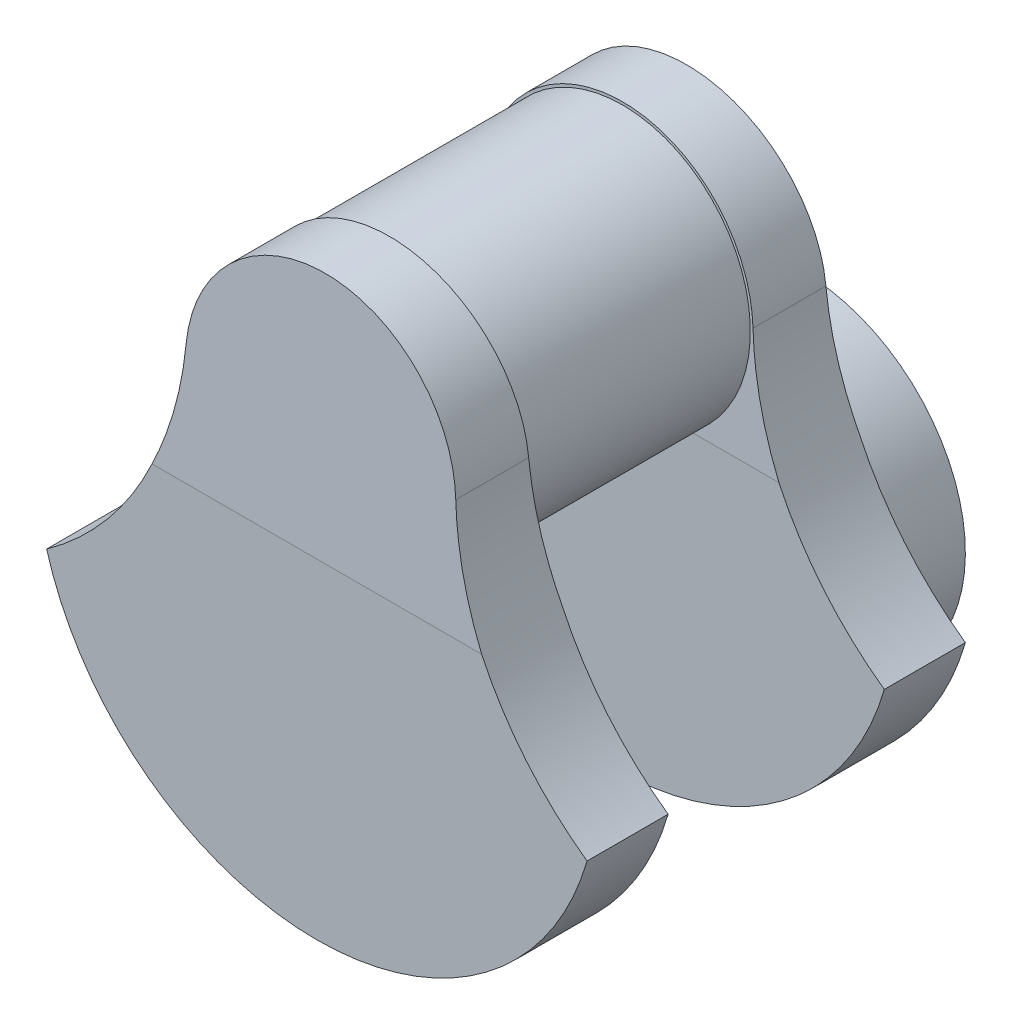
ISO-10303-21;
HEADER;
FILE_DESCRIPTION(('STEP AP214'),'2;1');
FILE_NAME('part.step','',(''),(''),'','','');
FILE_SCHEMA(('AUTOMOTIVE_DESIGN { 1 0 10303 214 1 1 1 1 }'));
ENDSEC;
DATA;
#1=APPLICATION_CONTEXT('core data for automotive mechanical design processes');
#2=APPLICATION_PROTOCOL_DEFINITION('international standard','automotive_design',2000,#1);
#3=PRODUCT_CONTEXT('',#1,'mechanical');
#4=PRODUCT('Part','Part','',(#3));
#5=PRODUCT_RELATED_PRODUCT_CATEGORY('part','',(#4));
#6=PRODUCT_DEFINITION_FORMATION('','',#4);
#7=PRODUCT_DEFINITION_CONTEXT('part definition',#1,'design');
#8=PRODUCT_DEFINITION('design','',#6,#7);
#9=PRODUCT_DEFINITION_SHAPE('','',#8);
#10=(LENGTH_UNIT() NAMED_UNIT(*) SI_UNIT(.MILLI.,.METRE.));
#11=(NAMED_UNIT(*) PLANE_ANGLE_UNIT() SI_UNIT($,.RADIAN.));
#12=(NAMED_UNIT(*) SI_UNIT($,.STERADIAN.) SOLID_ANGLE_UNIT());
#13=UNCERTAINTY_MEASURE_WITH_UNIT(LENGTH_MEASURE(1.E-05),#10,'distance_accuracy_value','');
#14=(GEOMETRIC_REPRESENTATION_CONTEXT(3) GLOBAL_UNCERTAINTY_ASSIGNED_CONTEXT((#13)) GLOBAL_UNIT_ASSIGNED_CONTEXT((#10,
#11,#12)) REPRESENTATION_CONTEXT('',''));
#15=CARTESIAN_POINT('',(0.,0.,0.));
#16=DIRECTION('',(0.,0.,1.));
#17=DIRECTION('',(1.,0.,0.));
#18=AXIS2_PLACEMENT_3D('',#15,#16,#17);
#19=CARTESIAN_POINT('',(-49.9962379807444,29.,-47.5));
#20=DIRECTION('',(0.,-0.0348994967024933,-0.999390827019096));
#21=DIRECTION('',(0.,0.999390827019096,-0.0348994967024933));
#22=AXIS2_PLACEMENT_3D('',#19,#20,#21);
#23=PLANE('',#22);
#24=CARTESIAN_POINT('',(0.,49.,-48.1984153898348));
#25=DIRECTION('',(0.,-0.0348994967024933,-0.999390827019096));
#26=DIRECTION('',(0.,-0.999390827019096,0.0348994967024933));
#27=AXIS2_PLACEMENT_3D('',#24,#25,#26);
#28=ELLIPSE('',#27,24.5149338353211,24.5);
#29=CARTESIAN_POINT('',(14.1509716980846,28.9999999999998,-47.5));
#30=VERTEX_POINT('',#29);
#31=CARTESIAN_POINT('',(-14.1509716980849,29.,-47.5));
#32=VERTEX_POINT('',#31);
#33=EDGE_CURVE('E45',#30,#32,#28,.F.);
#34=ORIENTED_EDGE('',*,*,#33,.F.);
#35=DIRECTION('',(1.,0.,0.));
#36=VECTOR('',#35,1.);
#37=CARTESIAN_POINT('',(42.412093190922,28.9999999999998,-47.5));
#38=LINE('',#37,#36);
#39=CARTESIAN_POINT('',(30.4957879413426,29.,-47.5));
#40=VERTEX_POINT('',#39);
#41=EDGE_CURVE('E156',#30,#40,#38,.T.);
#42=ORIENTED_EDGE('',*,*,#41,.T.);
#43=CARTESIAN_POINT('',(84.8241863818441,54.464192955798,-48.3892292125026));
#44=DIRECTION('',(0.,-0.0348994967024933,-0.999390827019096));
#45=DIRECTION('',(0.,0.999390827019096,-0.0348994967024933));
#46=AXIS2_PLACEMENT_3D('',#43,#44,#45);
#47=ELLIPSE('',#46,60.0365726579294,60.0000000000001);
#48=CARTESIAN_POINT('',(24.9482901123071,50.6071155752347,-48.2545371023842));
#49=VERTEX_POINT('',#48);
#50=EDGE_CURVE('E194',#49,#40,#47,.F.);
#51=ORIENTED_EDGE('',*,*,#50,.F.);
#52=CARTESIAN_POINT('',(0.,49.,-48.1984153898348));
#53=DIRECTION('',(0.,-0.0348994967024933,-0.999390827019096));
#54=DIRECTION('',(0.,0.999390827019096,-0.0348994967024933));
#55=AXIS2_PLACEMENT_3D('',#52,#53,#54);
#56=ELLIPSE('',#55,25.0152386074705,25.);
#57=CARTESIAN_POINT('',(-24.9482901123071,50.6071155752347,-48.2545371023842));
#58=VERTEX_POINT('',#57);
#59=EDGE_CURVE('E190',#58,#49,#56,.T.);
#60=ORIENTED_EDGE('',*,*,#59,.F.);
#61=CARTESIAN_POINT('',(-84.8241863818444,54.4641929557982,-48.3892292125026));
#62=DIRECTION('',(0.,-0.0348994967024933,-0.999390827019096));
#63=DIRECTION('',(0.,0.999390827019096,-0.0348994967024933));
#64=AXIS2_PLACEMENT_3D('',#61,#62,#63);
#65=ELLIPSE('',#64,60.0365726579297,60.0000000000004);
#66=CARTESIAN_POINT('',(-30.4957879413426,29.,-47.5));
#67=VERTEX_POINT('',#66);
#68=EDGE_CURVE('E186',#67,#58,#65,.F.);
#69=ORIENTED_EDGE('',*,*,#68,.F.);
#70=EDGE_CURVE('E315',#67,#32,#38,.T.);
#71=ORIENTED_EDGE('',*,*,#70,.T.);
#72=EDGE_LOOP('',(#34,#42,#51,#60,#69,#71));
#73=FACE_BOUND('',#72,.T.);
#74=ADVANCED_FACE('F41',(#73),#23,.F.);
#75=CARTESIAN_POINT('',(0.,20.,7.5));
#76=DIRECTION('',(0.,0.,-1.));
#77=DIRECTION('',(-1.,0.,0.));
#78=AXIS2_PLACEMENT_3D('',#75,#76,#77);
#79=CYLINDRICAL_SURFACE('',#78,52.02671366031);
#80=CARTESIAN_POINT('',(0.,20.,-7.5));
#81=DIRECTION('',(0.,0.,1.));
#82=DIRECTION('',(1.,0.,0.));
#83=AXIS2_PLACEMENT_3D('',#80,#81,#82);
#84=CIRCLE('',#83,52.02671366031);
#85=CARTESIAN_POINT('',(-49.9962379807444,5.60711557523474,-7.5));
#86=VERTEX_POINT('',#85);
#87=CARTESIAN_POINT('',(49.9962379807444,5.60711557523472,-7.5));
#88=VERTEX_POINT('',#87);
#89=EDGE_CURVE('E262',#86,#88,#84,.T.);
#90=ORIENTED_EDGE('',*,*,#89,.T.);
#91=DIRECTION('',(0.,0.,-1.));
#92=VECTOR('',#91,1.);
#93=CARTESIAN_POINT('',(49.9962379807444,5.60711557523472,7.5));
#94=LINE('',#93,#92);
#95=CARTESIAN_POINT('',(49.9962379807444,5.60711557523472,7.5));
#96=VERTEX_POINT('',#95);
#97=EDGE_CURVE('E296',#96,#88,#94,.T.);
#98=ORIENTED_EDGE('',*,*,#97,.F.);
#99=CARTESIAN_POINT('',(0.,20.,7.5));
#100=DIRECTION('',(0.,0.,1.));
#101=DIRECTION('',(1.,0.,0.));
#102=AXIS2_PLACEMENT_3D('',#99,#100,#101);
#103=CIRCLE('',#102,52.02671366031);
#104=CARTESIAN_POINT('',(-49.9962379807444,5.60711557523474,7.5));
#105=VERTEX_POINT('',#104);
#106=EDGE_CURVE('E263',#105,#96,#103,.T.);
#107=ORIENTED_EDGE('',*,*,#106,.F.);
#108=DIRECTION('',(0.,0.,-1.));
#109=VECTOR('',#108,1.);
#110=CARTESIAN_POINT('',(-49.9962379807444,5.60711557523474,7.5));
#111=LINE('',#110,#109);
#112=EDGE_CURVE('E275',#105,#86,#111,.T.);
#113=ORIENTED_EDGE('',*,*,#112,.T.);
#114=EDGE_LOOP('',(#90,#98,#107,#113));
#115=FACE_BOUND('',#114,.T.);
#116=ADVANCED_FACE('F43',(#115),#79,.T.);
#117=CARTESIAN_POINT('',(84.8241863818441,54.464192955798,7.5));
#118=DIRECTION('',(0.,0.,-1.));
#119=DIRECTION('',(-1.,0.,0.));
#120=AXIS2_PLACEMENT_3D('',#117,#118,#119);
#121=CYLINDRICAL_SURFACE('',#120,60.0000000000001);
#122=DIRECTION('',(0.,0.,-1.));
#123=VECTOR('',#122,1.);
#124=CARTESIAN_POINT('',(24.9482901123071,50.6071155752347,7.5));
#125=LINE('',#124,#123);
#126=CARTESIAN_POINT('',(24.9482901123071,50.6071155752347,6.74546289761584));
#127=VERTEX_POINT('',#126);
#128=CARTESIAN_POINT('',(24.9482901123071,50.6071155752347,-6.74546289761584));
#129=VERTEX_POINT('',#128);
#130=EDGE_CURVE('E292',#127,#129,#125,.T.);
#131=ORIENTED_EDGE('',*,*,#130,.F.);
#132=CARTESIAN_POINT('',(84.8241863818441,54.464192955798,6.61077078749738));
#133=DIRECTION('',(0.,-0.0348994967024933,-0.999390827019096));
#134=DIRECTION('',(0.,0.999390827019096,-0.0348994967024933));
#135=AXIS2_PLACEMENT_3D('',#132,#133,#134);
#136=ELLIPSE('',#135,60.0365726579294,60.0000000000001);
#137=CARTESIAN_POINT('',(30.4957879413425,29.,7.49999999999999));
#138=VERTEX_POINT('',#137);
#139=EDGE_CURVE('E258',#127,#138,#136,.F.);
#140=ORIENTED_EDGE('',*,*,#139,.T.);
#141=CARTESIAN_POINT('',(84.8241863818441,54.464192955798,7.5));
#142=DIRECTION('',(0.,0.,-1.));
#143=DIRECTION('',(1.,0.,0.));
#144=AXIS2_PLACEMENT_3D('',#141,#142,#143);
#145=CIRCLE('',#144,60.0000000000001);
#146=EDGE_CURVE('E267',#96,#138,#145,.T.);
#147=ORIENTED_EDGE('',*,*,#146,.F.);
#148=ORIENTED_EDGE('',*,*,#97,.T.);
#149=CARTESIAN_POINT('',(84.8241863818441,54.464192955798,-7.5));
#150=DIRECTION('',(0.,0.,-1.));
#151=DIRECTION('',(1.,0.,0.));
#152=AXIS2_PLACEMENT_3D('',#149,#150,#151);
#153=CIRCLE('',#152,60.0000000000001);
#154=CARTESIAN_POINT('',(30.4957879413425,28.9999999999999,-7.5));
#155=VERTEX_POINT('',#154);
#156=EDGE_CURVE('E279',#88,#155,#153,.T.);
#157=ORIENTED_EDGE('',*,*,#156,.T.);
#158=CARTESIAN_POINT('',(84.8241863818441,54.464192955798,-6.61077078749738));
#159=DIRECTION('',(0.,-0.0348994967024933,0.999390827019096));
#160=DIRECTION('',(0.,-0.999390827019096,-0.0348994967024933));
#161=AXIS2_PLACEMENT_3D('',#158,#159,#160);
#162=ELLIPSE('',#161,60.0365726579294,60.0000000000001);
#163=EDGE_CURVE('E246',#155,#129,#162,.F.);
#164=ORIENTED_EDGE('',*,*,#163,.T.);
#165=EDGE_LOOP('',(#131,#140,#147,#148,#157,#164));
#166=FACE_BOUND('',#165,.T.);
#167=ADVANCED_FACE('F351',(#166),#121,.F.);
#168=CARTESIAN_POINT('',(0.,49.,7.5));
#169=DIRECTION('',(0.,0.,-1.));
#170=DIRECTION('',(-1.,0.,0.));
#171=AXIS2_PLACEMENT_3D('',#168,#169,#170);
#172=CYLINDRICAL_SURFACE('',#171,25.);
#173=DIRECTION('',(0.,0.,-1.));
#174=VECTOR('',#173,1.);
#175=CARTESIAN_POINT('',(-24.9482901123071,50.6071155752347,7.5));
#176=LINE('',#175,#174);
#177=CARTESIAN_POINT('',(-24.9482901123071,50.6071155752347,6.74546289761584));
#178=VERTEX_POINT('',#177);
#179=CARTESIAN_POINT('',(-24.9482901123071,50.6071155752347,-6.74546289761584));
#180=VERTEX_POINT('',#179);
#181=EDGE_CURVE('E288',#178,#180,#176,.T.);
#182=ORIENTED_EDGE('',*,*,#181,.F.);
#183=CARTESIAN_POINT('',(0.,49.,6.80158461016519));
#184=DIRECTION('',(0.,-0.0348994967024933,-0.999390827019096));
#185=DIRECTION('',(0.,0.999390827019096,-0.0348994967024933));
#186=AXIS2_PLACEMENT_3D('',#183,#184,#185);
#187=ELLIPSE('',#186,25.0152386074705,25.);
#188=EDGE_CURVE('E254',#178,#127,#187,.T.);
#189=ORIENTED_EDGE('',*,*,#188,.T.);
#190=ORIENTED_EDGE('',*,*,#130,.T.);
#191=CARTESIAN_POINT('',(0.,49.,-6.80158461016519));
#192=DIRECTION('',(0.,-0.0348994967024933,0.999390827019096));
#193=DIRECTION('',(0.,-0.999390827019096,-0.0348994967024933));
#194=AXIS2_PLACEMENT_3D('',#191,#192,#193);
#195=ELLIPSE('',#194,25.0152386074705,25.);
#196=EDGE_CURVE('E243',#129,#180,#195,.T.);
#197=ORIENTED_EDGE('',*,*,#196,.T.);
#198=EDGE_LOOP('',(#182,#189,#190,#197));
#199=FACE_BOUND('',#198,.T.);
#200=ADVANCED_FACE('F505',(#199),#172,.T.);
#201=CARTESIAN_POINT('',(-84.8241863818444,54.4641929557982,7.5));
#202=DIRECTION('',(0.,0.,-1.));
#203=DIRECTION('',(-1.,0.,0.));
#204=AXIS2_PLACEMENT_3D('',#201,#202,#203);
#205=CYLINDRICAL_SURFACE('',#204,60.0000000000004);
#206=CARTESIAN_POINT('',(-84.8241863818444,54.4641929557982,7.5));
#207=DIRECTION('',(0.,0.,-1.));
#208=DIRECTION('',(-1.,0.,0.));
#209=AXIS2_PLACEMENT_3D('',#206,#207,#208);
#210=CIRCLE('',#209,60.0000000000004);
#211=CARTESIAN_POINT('',(-30.4957879413426,28.9999999999999,7.5));
#212=VERTEX_POINT('',#211);
#213=EDGE_CURVE('E272',#212,#105,#210,.T.);
#214=ORIENTED_EDGE('',*,*,#213,.F.);
#215=CARTESIAN_POINT('',(-84.8241863818444,54.4641929557982,6.61077078749738));
#216=DIRECTION('',(0.,-0.0348994967024933,-0.999390827019096));
#217=DIRECTION('',(0.,0.999390827019096,-0.0348994967024933));
#218=AXIS2_PLACEMENT_3D('',#215,#216,#217);
#219=ELLIPSE('',#218,60.0365726579297,60.0000000000004);
#220=EDGE_CURVE('E250',#212,#178,#219,.F.);
#221=ORIENTED_EDGE('',*,*,#220,.T.);
#222=ORIENTED_EDGE('',*,*,#181,.T.);
#223=CARTESIAN_POINT('',(-84.8241863818444,54.4641929557982,-6.61077078749737));
#224=DIRECTION('',(0.,-0.0348994967024933,0.999390827019096));
#225=DIRECTION('',(0.,-0.999390827019096,-0.0348994967024933));
#226=AXIS2_PLACEMENT_3D('',#223,#224,#225);
#227=ELLIPSE('',#226,60.0365726579297,60.0000000000004);
#228=CARTESIAN_POINT('',(-30.4957879413426,29.,-7.49999999999999));
#229=VERTEX_POINT('',#228);
#230=EDGE_CURVE('E239',#180,#229,#227,.F.);
#231=ORIENTED_EDGE('',*,*,#230,.T.);
#232=CARTESIAN_POINT('',(-84.8241863818444,54.4641929557982,-7.5));
#233=DIRECTION('',(0.,0.,-1.));
#234=DIRECTION('',(-1.,0.,0.));
#235=AXIS2_PLACEMENT_3D('',#232,#233,#234);
#236=CIRCLE('',#235,60.0000000000004);
#237=EDGE_CURVE('E268',#229,#86,#236,.T.);
#238=ORIENTED_EDGE('',*,*,#237,.T.);
#239=ORIENTED_EDGE('',*,*,#112,.F.);
#240=EDGE_LOOP('',(#214,#221,#222,#231,#238,#239));
#241=FACE_BOUND('',#240,.T.);
#242=ADVANCED_FACE('F359',(#241),#205,.F.);
#243=CARTESIAN_POINT('',(42.412093190922,37.232096477899,7.5));
#244=DIRECTION('',(0.,0.,1.));
#245=DIRECTION('',(1.,0.,0.));
#246=AXIS2_PLACEMENT_3D('',#243,#244,#245);
#247=PLANE('',#246);
#248=DIRECTION('',(1.,0.,0.));
#249=VECTOR('',#248,1.);
#250=CARTESIAN_POINT('',(42.412093190922,28.9999999999999,7.5));
#251=LINE('',#250,#249);
#252=EDGE_CURVE('E305',#212,#138,#251,.T.);
#253=ORIENTED_EDGE('',*,*,#252,.F.);
#254=ORIENTED_EDGE('',*,*,#213,.T.);
#255=ORIENTED_EDGE('',*,*,#106,.T.);
#256=ORIENTED_EDGE('',*,*,#146,.T.);
#257=EDGE_LOOP('',(#253,#254,#255,#256));
#258=FACE_BOUND('',#257,.T.);
#259=ADVANCED_FACE('F482',(#258),#247,.T.);
#260=CARTESIAN_POINT('',(42.412093190922,37.232096477899,-7.5));
#261=DIRECTION('',(0.,0.,1.));
#262=DIRECTION('',(1.,0.,0.));
#263=AXIS2_PLACEMENT_3D('',#260,#261,#262);
#264=PLANE('',#263);
#265=DIRECTION('',(1.,0.,0.));
#266=VECTOR('',#265,1.);
#267=CARTESIAN_POINT('',(42.412093190922,28.9999999999999,-7.5));
#268=LINE('',#267,#266);
#269=CARTESIAN_POINT('',(-14.1509716980847,28.9999999999999,-7.5));
#270=VERTEX_POINT('',#269);
#271=EDGE_CURVE('E301',#229,#270,#268,.T.);
#272=ORIENTED_EDGE('',*,*,#271,.T.);
#273=CARTESIAN_POINT('',(0.,49.,-7.5));
#274=DIRECTION('',(0.,0.,1.));
#275=DIRECTION('',(1.,0.,0.));
#276=AXIS2_PLACEMENT_3D('',#273,#274,#275);
#277=CIRCLE('',#276,24.5);
#278=CARTESIAN_POINT('',(14.1509716980847,28.9999999999999,-7.5));
#279=VERTEX_POINT('',#278);
#280=EDGE_CURVE('E235',#270,#279,#277,.T.);
#281=ORIENTED_EDGE('',*,*,#280,.T.);
#282=EDGE_CURVE('E300',#279,#155,#268,.T.);
#283=ORIENTED_EDGE('',*,*,#282,.T.);
#284=ORIENTED_EDGE('',*,*,#156,.F.);
#285=ORIENTED_EDGE('',*,*,#89,.F.);
#286=ORIENTED_EDGE('',*,*,#237,.F.);
#287=EDGE_LOOP('',(#272,#281,#283,#284,#285,#286));
#288=FACE_BOUND('',#287,.T.);
#289=ADVANCED_FACE('F344',(#288),#264,.F.);
#290=CARTESIAN_POINT('',(-49.9962379807444,29.,-7.49999999999999));
#291=DIRECTION('',(0.,-0.0348994967024933,0.999390827019096));
#292=DIRECTION('',(0.,-0.999390827019096,-0.0348994967024933));
#293=AXIS2_PLACEMENT_3D('',#290,#291,#292);
#294=PLANE('',#293);
#295=ORIENTED_EDGE('',*,*,#282,.F.);
#296=CARTESIAN_POINT('',(0.,49.,-6.80158461016519));
#297=DIRECTION('',(0.,-0.0348994967024933,0.999390827019096));
#298=DIRECTION('',(0.,0.999390827019096,0.0348994967024933));
#299=AXIS2_PLACEMENT_3D('',#296,#297,#298);
#300=ELLIPSE('',#299,24.5149338353211,24.5);
#301=EDGE_CURVE('E308',#279,#270,#300,.T.);
#302=ORIENTED_EDGE('',*,*,#301,.T.);
#303=ORIENTED_EDGE('',*,*,#271,.F.);
#304=ORIENTED_EDGE('',*,*,#230,.F.);
#305=ORIENTED_EDGE('',*,*,#196,.F.);
#306=ORIENTED_EDGE('',*,*,#163,.F.);
#307=EDGE_LOOP('',(#295,#302,#303,#304,#305,#306));
#308=FACE_BOUND('',#307,.T.);
#309=ADVANCED_FACE('F347',(#308),#294,.F.);
#310=CARTESIAN_POINT('',(-49.9962379807444,29.,7.49999999999999));
#311=DIRECTION('',(0.,-0.0348994967024933,-0.999390827019096));
#312=DIRECTION('',(0.,0.999390827019096,-0.0348994967024933));
#313=AXIS2_PLACEMENT_3D('',#310,#311,#312);
#314=PLANE('',#313);
#315=ORIENTED_EDGE('',*,*,#188,.F.);
#316=ORIENTED_EDGE('',*,*,#220,.F.);
#317=ORIENTED_EDGE('',*,*,#252,.T.);
#318=ORIENTED_EDGE('',*,*,#139,.F.);
#319=EDGE_LOOP('',(#315,#316,#317,#318));
#320=FACE_BOUND('',#319,.T.);
#321=ADVANCED_FACE('F362',(#320),#314,.F.);
#322=CARTESIAN_POINT('',(0.,49.,-50.));
#323=DIRECTION('',(0.,0.,1.));
#324=DIRECTION('',(1.,0.,0.));
#325=AXIS2_PLACEMENT_3D('',#322,#323,#324);
#326=CYLINDRICAL_SURFACE('',#325,24.5);
#327=CARTESIAN_POINT('',(0.,49.,-47.5));
#328=DIRECTION('',(0.,0.,1.));
#329=DIRECTION('',(1.,0.,0.));
#330=AXIS2_PLACEMENT_3D('',#327,#328,#329);
#331=CIRCLE('',#330,24.5);
#332=EDGE_CURVE('E312',#30,#32,#331,.F.);
#333=ORIENTED_EDGE('',*,*,#332,.F.);
#334=ORIENTED_EDGE('',*,*,#33,.T.);
#335=EDGE_LOOP('',(#333,#334));
#336=FACE_BOUND('',#335,.T.);
#337=ORIENTED_EDGE('',*,*,#280,.F.);
#338=ORIENTED_EDGE('',*,*,#301,.F.);
#339=EDGE_LOOP('',(#337,#338));
#340=FACE_BOUND('',#339,.T.);
#341=ADVANCED_FACE('F321',(#336,#340),#326,.T.);
#342=CARTESIAN_POINT('',(0.,20.,-47.5));
#343=DIRECTION('',(0.,0.,-1.));
#344=DIRECTION('',(-1.,0.,0.));
#345=AXIS2_PLACEMENT_3D('',#342,#343,#344);
#346=CYLINDRICAL_SURFACE('',#345,52.02671366031);
#347=CARTESIAN_POINT('',(0.,20.,-62.5));
#348=DIRECTION('',(0.,0.,1.));
#349=DIRECTION('',(1.,0.,0.));
#350=AXIS2_PLACEMENT_3D('',#347,#348,#349);
#351=CIRCLE('',#350,52.02671366031);
#352=CARTESIAN_POINT('',(-49.9962379807444,5.60711557523474,-62.5));
#353=VERTEX_POINT('',#352);
#354=CARTESIAN_POINT('',(49.9962379807444,5.60711557523472,-62.5));
#355=VERTEX_POINT('',#354);
#356=EDGE_CURVE('E198',#353,#355,#351,.T.);
#357=ORIENTED_EDGE('',*,*,#356,.T.);
#358=DIRECTION('',(0.,0.,-1.));
#359=VECTOR('',#358,1.);
#360=CARTESIAN_POINT('',(49.9962379807444,5.60711557523472,-47.5));
#361=LINE('',#360,#359);
#362=CARTESIAN_POINT('',(49.9962379807444,5.60711557523472,-47.5));
#363=VERTEX_POINT('',#362);
#364=EDGE_CURVE('E231',#363,#355,#361,.T.);
#365=ORIENTED_EDGE('',*,*,#364,.F.);
#366=CARTESIAN_POINT('',(0.,20.,-47.5));
#367=DIRECTION('',(0.,0.,1.));
#368=DIRECTION('',(1.,0.,0.));
#369=AXIS2_PLACEMENT_3D('',#366,#367,#368);
#370=CIRCLE('',#369,52.02671366031);
#371=CARTESIAN_POINT('',(-49.9962379807444,5.60711557523474,-47.5));
#372=VERTEX_POINT('',#371);
#373=EDGE_CURVE('E199',#372,#363,#370,.T.);
#374=ORIENTED_EDGE('',*,*,#373,.F.);
#375=DIRECTION('',(0.,0.,-1.));
#376=VECTOR('',#375,1.);
#377=CARTESIAN_POINT('',(-49.9962379807444,5.60711557523474,-47.5));
#378=LINE('',#377,#376);
#379=EDGE_CURVE('E210',#372,#353,#378,.T.);
#380=ORIENTED_EDGE('',*,*,#379,.T.);
#381=EDGE_LOOP('',(#357,#365,#374,#380));
#382=FACE_BOUND('',#381,.T.);
#383=ADVANCED_FACE('F338',(#382),#346,.T.);
#384=CARTESIAN_POINT('',(84.8241863818441,54.464192955798,-47.5));
#385=DIRECTION('',(0.,0.,-1.));
#386=DIRECTION('',(-1.,0.,0.));
#387=AXIS2_PLACEMENT_3D('',#384,#385,#386);
#388=CYLINDRICAL_SURFACE('',#387,60.0000000000001);
#389=DIRECTION('',(0.,0.,-1.));
#390=VECTOR('',#389,1.);
#391=CARTESIAN_POINT('',(24.9482901123071,50.6071155752347,-47.5));
#392=LINE('',#391,#390);
#393=CARTESIAN_POINT('',(24.9482901123071,50.6071155752347,-61.7454628976158));
#394=VERTEX_POINT('',#393);
#395=EDGE_CURVE('E227',#49,#394,#392,.T.);
#396=ORIENTED_EDGE('',*,*,#395,.F.);
#397=ORIENTED_EDGE('',*,*,#50,.T.);
#398=CARTESIAN_POINT('',(84.8241863818441,54.464192955798,-47.5));
#399=DIRECTION('',(0.,0.,-1.));
#400=DIRECTION('',(1.,0.,0.));
#401=AXIS2_PLACEMENT_3D('',#398,#399,#400);
#402=CIRCLE('',#401,60.0000000000001);
#403=EDGE_CURVE('E203',#363,#40,#402,.T.);
#404=ORIENTED_EDGE('',*,*,#403,.F.);
#405=ORIENTED_EDGE('',*,*,#364,.T.);
#406=CARTESIAN_POINT('',(84.8241863818441,54.464192955798,-62.5));
#407=DIRECTION('',(0.,0.,-1.));
#408=DIRECTION('',(1.,0.,0.));
#409=AXIS2_PLACEMENT_3D('',#406,#407,#408);
#410=CIRCLE('',#409,60.0000000000001);
#411=CARTESIAN_POINT('',(30.4957879413426,28.9999999999998,-62.5));
#412=VERTEX_POINT('',#411);
#413=EDGE_CURVE('E214',#355,#412,#410,.T.);
#414=ORIENTED_EDGE('',*,*,#413,.T.);
#415=CARTESIAN_POINT('',(84.8241863818441,54.464192955798,-61.6107707874974));
#416=DIRECTION('',(0.,-0.0348994967024933,0.999390827019096));
#417=DIRECTION('',(0.,-0.999390827019096,-0.0348994967024933));
#418=AXIS2_PLACEMENT_3D('',#415,#416,#417);
#419=ELLIPSE('',#418,60.0365726579294,60.0000000000001);
#420=EDGE_CURVE('E182',#412,#394,#419,.F.);
#421=ORIENTED_EDGE('',*,*,#420,.T.);
#422=EDGE_LOOP('',(#396,#397,#404,#405,#414,#421));
#423=FACE_BOUND('',#422,.T.);
#424=ADVANCED_FACE('F330',(#423),#388,.F.);
#425=CARTESIAN_POINT('',(0.,49.,-47.5));
#426=DIRECTION('',(0.,0.,-1.));
#427=DIRECTION('',(-1.,0.,0.));
#428=AXIS2_PLACEMENT_3D('',#425,#426,#427);
#429=CYLINDRICAL_SURFACE('',#428,25.);
#430=DIRECTION('',(0.,0.,-1.));
#431=VECTOR('',#430,1.);
#432=CARTESIAN_POINT('',(-24.9482901123071,50.6071155752347,-47.5));
#433=LINE('',#432,#431);
#434=CARTESIAN_POINT('',(-24.9482901123071,50.6071155752347,-61.7454628976158));
#435=VERTEX_POINT('',#434);
#436=EDGE_CURVE('E223',#58,#435,#433,.T.);
#437=ORIENTED_EDGE('',*,*,#436,.F.);
#438=ORIENTED_EDGE('',*,*,#59,.T.);
#439=ORIENTED_EDGE('',*,*,#395,.T.);
#440=CARTESIAN_POINT('',(0.,49.,-61.8015846101652));
#441=DIRECTION('',(0.,-0.0348994967024933,0.999390827019096));
#442=DIRECTION('',(0.,-0.999390827019096,-0.0348994967024933));
#443=AXIS2_PLACEMENT_3D('',#440,#441,#442);
#444=ELLIPSE('',#443,25.0152386074705,25.);
#445=EDGE_CURVE('E179',#394,#435,#444,.T.);
#446=ORIENTED_EDGE('',*,*,#445,.T.);
#447=EDGE_LOOP('',(#437,#438,#439,#446));
#448=FACE_BOUND('',#447,.T.);
#449=ADVANCED_FACE('F333',(#448),#429,.T.);
#450=CARTESIAN_POINT('',(-84.8241863818444,54.4641929557982,-47.5));
#451=DIRECTION('',(0.,0.,-1.));
#452=DIRECTION('',(-1.,0.,0.));
#453=AXIS2_PLACEMENT_3D('',#450,#451,#452);
#454=CYLINDRICAL_SURFACE('',#453,60.0000000000004);
#455=CARTESIAN_POINT('',(-84.8241863818444,54.4641929557982,-47.5));
#456=DIRECTION('',(0.,0.,-1.));
#457=DIRECTION('',(-1.,0.,0.));
#458=AXIS2_PLACEMENT_3D('',#455,#456,#457);
#459=CIRCLE('',#458,60.0000000000004);
#460=EDGE_CURVE('E207',#67,#372,#459,.T.);
#461=ORIENTED_EDGE('',*,*,#460,.F.);
#462=ORIENTED_EDGE('',*,*,#68,.T.);
#463=ORIENTED_EDGE('',*,*,#436,.T.);
#464=CARTESIAN_POINT('',(-84.8241863818444,54.4641929557982,-61.6107707874974));
#465=DIRECTION('',(0.,-0.0348994967024933,0.999390827019096));
#466=DIRECTION('',(0.,-0.999390827019096,-0.0348994967024933));
#467=AXIS2_PLACEMENT_3D('',#464,#465,#466);
#468=ELLIPSE('',#467,60.0365726579297,60.0000000000004);
#469=CARTESIAN_POINT('',(-30.4957879413426,29.,-62.5));
#470=VERTEX_POINT('',#469);
#471=EDGE_CURVE('E174',#435,#470,#468,.F.);
#472=ORIENTED_EDGE('',*,*,#471,.T.);
#473=CARTESIAN_POINT('',(-84.8241863818444,54.4641929557982,-62.5));
#474=DIRECTION('',(0.,0.,-1.));
#475=DIRECTION('',(-1.,0.,0.));
#476=AXIS2_PLACEMENT_3D('',#473,#474,#475);
#477=CIRCLE('',#476,60.0000000000004);
#478=EDGE_CURVE('E151',#470,#353,#477,.T.);
#479=ORIENTED_EDGE('',*,*,#478,.T.);
#480=ORIENTED_EDGE('',*,*,#379,.F.);
#481=EDGE_LOOP('',(#461,#462,#463,#472,#479,#480));
#482=FACE_BOUND('',#481,.T.);
#483=ADVANCED_FACE('F335',(#482),#454,.F.);
#484=CARTESIAN_POINT('',(42.412093190922,37.232096477899,-47.5));
#485=DIRECTION('',(0.,0.,1.));
#486=DIRECTION('',(1.,0.,0.));
#487=AXIS2_PLACEMENT_3D('',#484,#485,#486);
#488=PLANE('',#487);
#489=ORIENTED_EDGE('',*,*,#70,.F.);
#490=ORIENTED_EDGE('',*,*,#460,.T.);
#491=ORIENTED_EDGE('',*,*,#373,.T.);
#492=ORIENTED_EDGE('',*,*,#403,.T.);
#493=ORIENTED_EDGE('',*,*,#41,.F.);
#494=ORIENTED_EDGE('',*,*,#332,.T.);
#495=EDGE_LOOP('',(#489,#490,#491,#492,#493,#494));
#496=FACE_BOUND('',#495,.T.);
#497=ADVANCED_FACE('F324',(#496),#488,.T.);
#498=CARTESIAN_POINT('',(42.412093190922,37.232096477899,-62.5));
#499=DIRECTION('',(0.,0.,1.));
#500=DIRECTION('',(1.,0.,0.));
#501=AXIS2_PLACEMENT_3D('',#498,#499,#500);
#502=PLANE('',#501);
#503=CARTESIAN_POINT('',(0.,0.,-62.5));
#504=DIRECTION('',(0.,0.,-1.));
#505=DIRECTION('',(-1.,0.,0.));
#506=AXIS2_PLACEMENT_3D('',#503,#504,#505);
#507=CIRCLE('',#506,30.);
#508=CARTESIAN_POINT('',(7.68114574786931,28.9999999999998,-62.5));
#509=VERTEX_POINT('',#508);
#510=CARTESIAN_POINT('',(-7.68114574786931,28.9999999999998,-62.5));
#511=VERTEX_POINT('',#510);
#512=EDGE_CURVE('E11',#509,#511,#507,.T.);
#513=ORIENTED_EDGE('',*,*,#512,.F.);
#514=DIRECTION('',(1.,0.,0.));
#515=VECTOR('',#514,1.);
#516=CARTESIAN_POINT('',(42.412093190922,28.9999999999998,-62.5));
#517=LINE('',#516,#515);
#518=EDGE_CURVE('E159',#509,#412,#517,.T.);
#519=ORIENTED_EDGE('',*,*,#518,.T.);
#520=ORIENTED_EDGE('',*,*,#413,.F.);
#521=ORIENTED_EDGE('',*,*,#356,.F.);
#522=ORIENTED_EDGE('',*,*,#478,.F.);
#523=EDGE_CURVE('E147',#470,#511,#517,.T.);
#524=ORIENTED_EDGE('',*,*,#523,.T.);
#525=EDGE_LOOP('',(#513,#519,#520,#521,#522,#524));
#526=FACE_BOUND('',#525,.T.);
#527=ADVANCED_FACE('F149',(#526),#502,.F.);
#528=CARTESIAN_POINT('',(-49.9962379807444,29.,-62.5));
#529=DIRECTION('',(0.,-0.0348994967024933,0.999390827019096));
#530=DIRECTION('',(0.,-0.999390827019096,-0.0348994967024933));
#531=AXIS2_PLACEMENT_3D('',#528,#529,#530);
#532=PLANE('',#531);
#533=ORIENTED_EDGE('',*,*,#523,.F.);
#534=ORIENTED_EDGE('',*,*,#471,.F.);
#535=ORIENTED_EDGE('',*,*,#445,.F.);
#536=ORIENTED_EDGE('',*,*,#420,.F.);
#537=ORIENTED_EDGE('',*,*,#518,.F.);
#538=EDGE_CURVE('E157',#511,#509,#517,.T.);
#539=ORIENTED_EDGE('',*,*,#538,.F.);
#540=EDGE_LOOP('',(#533,#534,#535,#536,#537,#539));
#541=FACE_BOUND('',#540,.T.);
#542=ADVANCED_FACE('F161',(#541),#532,.F.);
#543=CARTESIAN_POINT('',(0.,0.,-62.5));
#544=DIRECTION('',(0.,0.,-1.));
#545=DIRECTION('',(-1.,0.,0.));
#546=AXIS2_PLACEMENT_3D('',#543,#544,#545);
#547=PLANE('',#546);
#548=EDGE_CURVE('E52',#511,#509,#507,.T.);
#549=ORIENTED_EDGE('',*,*,#548,.F.);
#550=ORIENTED_EDGE('',*,*,#538,.T.);
#551=EDGE_LOOP('',(#549,#550));
#552=FACE_BOUND('',#551,.T.);
#553=ADVANCED_FACE('F169',(#552),#547,.F.);
#554=CARTESIAN_POINT('',(0.,0.,-82.5));
#555=DIRECTION('',(0.,0.,1.));
#556=DIRECTION('',(1.,0.,0.));
#557=AXIS2_PLACEMENT_3D('',#554,#555,#556);
#558=CYLINDRICAL_SURFACE('',#557,30.);
#559=CARTESIAN_POINT('',(0.,0.,-82.5));
#560=DIRECTION('',(0.,0.,-1.));
#561=DIRECTION('',(-1.,0.,0.));
#562=AXIS2_PLACEMENT_3D('',#559,#560,#561);
#563=CIRCLE('',#562,30.);
#564=CARTESIAN_POINT('',(-30.,0.,-82.5));
#565=VERTEX_POINT('',#564);
#566=EDGE_CURVE('E171',#565,#565,#563,.T.);
#567=ORIENTED_EDGE('',*,*,#566,.F.);
#568=EDGE_LOOP('',(#567));
#569=FACE_BOUND('',#568,.T.);
#570=ORIENTED_EDGE('',*,*,#548,.T.);
#571=ORIENTED_EDGE('',*,*,#512,.T.);
#572=EDGE_LOOP('',(#570,#571));
#573=FACE_BOUND('',#572,.T.);
#574=ADVANCED_FACE('F168',(#569,#573),#558,.T.);
#575=CARTESIAN_POINT('',(0.,0.,-82.5));
#576=DIRECTION('',(0.,0.,-1.));
#577=DIRECTION('',(-1.,0.,0.));
#578=AXIS2_PLACEMENT_3D('',#575,#576,#577);
#579=PLANE('',#578);
#580=ORIENTED_EDGE('',*,*,#566,.T.);
#581=EDGE_LOOP('',(#580));
#582=FACE_BOUND('',#581,.T.);
#583=ADVANCED_FACE('F425',(#582),#579,.T.);
#584=CLOSED_SHELL('',(#74,#116,#167,#200,#242,#259,#289,#309,#321,#341,#383,#424,#449,#483,#497,
#527,#542,#553,#574,#583));
#585=MANIFOLD_SOLID_BREP('B2',#584);
#586=ADVANCED_BREP_SHAPE_REPRESENTATION('',(#18,#585),#14);
#587=SHAPE_DEFINITION_REPRESENTATION(#9,#586);
ENDSEC;
END-ISO-10303-21;
